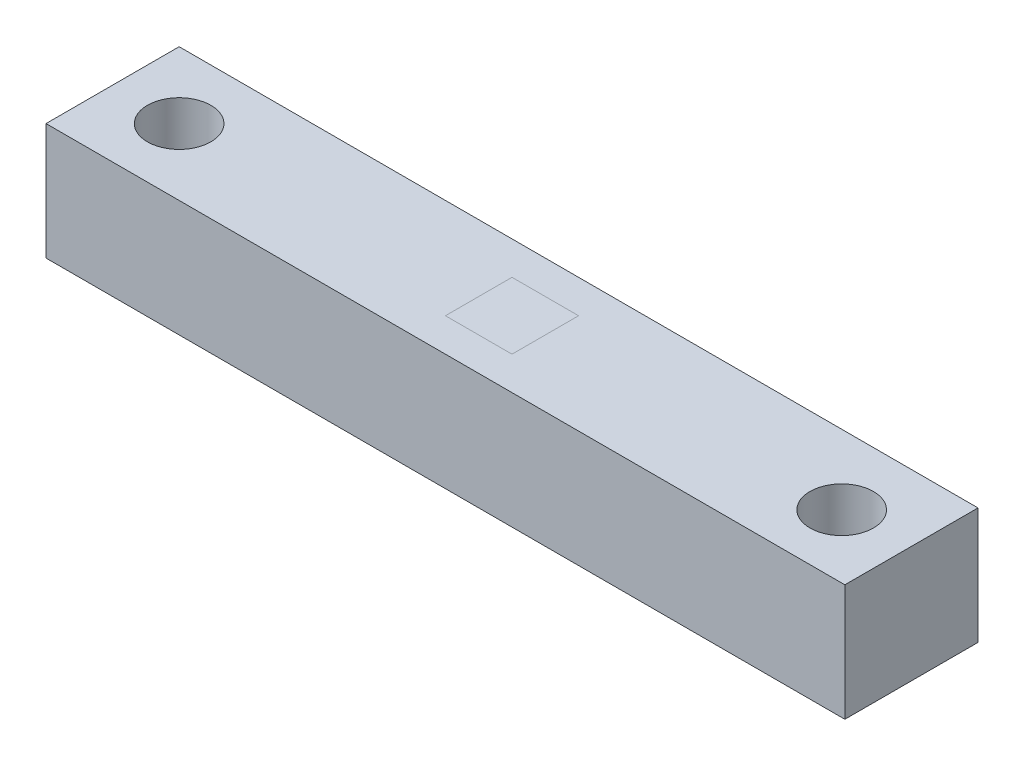
ISO-10303-21;
HEADER;
FILE_DESCRIPTION(('STEP AP214'),'2;1');
FILE_NAME('part.step','',(''),(''),'','','');
FILE_SCHEMA(('AUTOMOTIVE_DESIGN { 1 0 10303 214 1 1 1 1 }'));
ENDSEC;
DATA;
#1=APPLICATION_CONTEXT('core data for automotive mechanical design processes');
#2=APPLICATION_PROTOCOL_DEFINITION('international standard','automotive_design',2000,#1);
#3=PRODUCT_CONTEXT('',#1,'mechanical');
#4=PRODUCT('Part','Part','',(#3));
#5=PRODUCT_RELATED_PRODUCT_CATEGORY('part','',(#4));
#6=PRODUCT_DEFINITION_FORMATION('','',#4);
#7=PRODUCT_DEFINITION_CONTEXT('part definition',#1,'design');
#8=PRODUCT_DEFINITION('design','',#6,#7);
#9=PRODUCT_DEFINITION_SHAPE('','',#8);
#10=(LENGTH_UNIT() NAMED_UNIT(*) SI_UNIT(.MILLI.,.METRE.));
#11=(NAMED_UNIT(*) PLANE_ANGLE_UNIT() SI_UNIT($,.RADIAN.));
#12=(NAMED_UNIT(*) SI_UNIT($,.STERADIAN.) SOLID_ANGLE_UNIT());
#13=UNCERTAINTY_MEASURE_WITH_UNIT(LENGTH_MEASURE(1.E-05),#10,'distance_accuracy_value','');
#14=(GEOMETRIC_REPRESENTATION_CONTEXT(3) GLOBAL_UNCERTAINTY_ASSIGNED_CONTEXT((#13)) GLOBAL_UNIT_ASSIGNED_CONTEXT((#10,
#11,#12)) REPRESENTATION_CONTEXT('',''));
#15=CARTESIAN_POINT('',(0.,0.,0.));
#16=DIRECTION('',(0.,0.,1.));
#17=DIRECTION('',(1.,0.,0.));
#18=AXIS2_PLACEMENT_3D('',#15,#16,#17);
#19=CARTESIAN_POINT('',(120.,17.5,40.));
#20=DIRECTION('',(0.,-1.,0.));
#21=DIRECTION('',(1.,0.,0.));
#22=AXIS2_PLACEMENT_3D('',#19,#20,#21);
#23=PLANE('',#22);
#24=DIRECTION('',(-1.,0.,0.));
#25=VECTOR('',#24,1.);
#26=CARTESIAN_POINT('',(120.,17.5,0.));
#27=LINE('',#26,#25);
#28=CARTESIAN_POINT('',(120.,17.5,0.));
#29=VERTEX_POINT('',#28);
#30=CARTESIAN_POINT('',(-120.,17.5,0.));
#31=VERTEX_POINT('',#30);
#32=EDGE_CURVE('E116',#29,#31,#27,.T.);
#33=ORIENTED_EDGE('',*,*,#32,.T.);
#34=DIRECTION('',(0.,0.,-1.));
#35=VECTOR('',#34,1.);
#36=CARTESIAN_POINT('',(-120.,17.5,40.));
#37=LINE('',#36,#35);
#38=CARTESIAN_POINT('',(-120.,17.5,40.));
#39=VERTEX_POINT('',#38);
#40=EDGE_CURVE('E173',#39,#31,#37,.T.);
#41=ORIENTED_EDGE('',*,*,#40,.F.);
#42=DIRECTION('',(-1.,0.,0.));
#43=VECTOR('',#42,1.);
#44=CARTESIAN_POINT('',(120.,17.5,40.));
#45=LINE('',#44,#43);
#46=CARTESIAN_POINT('',(120.,17.5,40.));
#47=VERTEX_POINT('',#46);
#48=EDGE_CURVE('E115',#47,#39,#45,.T.);
#49=ORIENTED_EDGE('',*,*,#48,.F.);
#50=DIRECTION('',(0.,0.,-1.));
#51=VECTOR('',#50,1.);
#52=CARTESIAN_POINT('',(120.,17.5,40.));
#53=LINE('',#52,#51);
#54=EDGE_CURVE('E123',#47,#29,#53,.T.);
#55=ORIENTED_EDGE('',*,*,#54,.T.);
#56=EDGE_LOOP('',(#33,#41,#49,#55));
#57=FACE_BOUND('',#56,.T.);
#58=CARTESIAN_POINT('',(100.,17.5,20.95));
#59=DIRECTION('',(0.,1.,0.));
#60=DIRECTION('',(-1.,0.,0.));
#61=AXIS2_PLACEMENT_3D('',#58,#59,#60);
#62=CIRCLE('',#61,9.52500000000001);
#63=CARTESIAN_POINT('',(90.475,17.5,20.95));
#64=VERTEX_POINT('',#63);
#65=EDGE_CURVE('E187',#64,#64,#62,.T.);
#66=ORIENTED_EDGE('',*,*,#65,.F.);
#67=EDGE_LOOP('',(#66));
#68=FACE_BOUND('',#67,.T.);
#69=CARTESIAN_POINT('',(-100.,17.5,20.));
#70=DIRECTION('',(0.,1.,0.));
#71=DIRECTION('',(-1.,0.,0.));
#72=AXIS2_PLACEMENT_3D('',#69,#70,#71);
#73=CIRCLE('',#72,9.52500000000001);
#74=CARTESIAN_POINT('',(-109.525,17.5,20.));
#75=VERTEX_POINT('',#74);
#76=EDGE_CURVE('E185',#75,#75,#73,.T.);
#77=ORIENTED_EDGE('',*,*,#76,.F.);
#78=EDGE_LOOP('',(#77));
#79=FACE_BOUND('',#78,.T.);
#80=DIRECTION('',(0.,0.,1.));
#81=VECTOR('',#80,1.);
#82=CARTESIAN_POINT('',(-9.99999999999999,17.5,40.));
#83=LINE('',#82,#81);
#84=CARTESIAN_POINT('',(-9.99999999999999,17.5,10.));
#85=VERTEX_POINT('',#84);
#86=CARTESIAN_POINT('',(-9.99999999999999,17.5,30.));
#87=VERTEX_POINT('',#86);
#88=EDGE_CURVE('E11',#85,#87,#83,.T.);
#89=ORIENTED_EDGE('',*,*,#88,.F.);
#90=DIRECTION('',(-1.,0.,0.));
#91=VECTOR('',#90,1.);
#92=CARTESIAN_POINT('',(120.,17.5,9.99999999999999));
#93=LINE('',#92,#91);
#94=CARTESIAN_POINT('',(10.,17.5,10.));
#95=VERTEX_POINT('',#94);
#96=EDGE_CURVE('E119',#95,#85,#93,.T.);
#97=ORIENTED_EDGE('',*,*,#96,.F.);
#98=DIRECTION('',(0.,0.,-1.));
#99=VECTOR('',#98,1.);
#100=CARTESIAN_POINT('',(10.,17.5,40.));
#101=LINE('',#100,#99);
#102=CARTESIAN_POINT('',(10.,17.5,30.));
#103=VERTEX_POINT('',#102);
#104=EDGE_CURVE('E124',#103,#95,#101,.T.);
#105=ORIENTED_EDGE('',*,*,#104,.F.);
#106=DIRECTION('',(1.,0.,0.));
#107=VECTOR('',#106,1.);
#108=CARTESIAN_POINT('',(120.,17.5,30.));
#109=LINE('',#108,#107);
#110=EDGE_CURVE('E57',#87,#103,#109,.T.);
#111=ORIENTED_EDGE('',*,*,#110,.F.);
#112=EDGE_LOOP('',(#89,#97,#105,#111));
#113=FACE_BOUND('',#112,.T.);
#114=ADVANCED_FACE('F50',(#57,#68,#79,#113),#23,.F.);
#115=CARTESIAN_POINT('',(-120.,-17.5,40.));
#116=DIRECTION('',(1.,0.,0.));
#117=DIRECTION('',(0.,0.,-1.));
#118=AXIS2_PLACEMENT_3D('',#115,#116,#117);
#119=PLANE('',#118);
#120=DIRECTION('',(0.,-1.,0.));
#121=VECTOR('',#120,1.);
#122=CARTESIAN_POINT('',(-120.,-17.5,0.));
#123=LINE('',#122,#121);
#124=CARTESIAN_POINT('',(-120.,-17.5,0.));
#125=VERTEX_POINT('',#124);
#126=EDGE_CURVE('E118',#31,#125,#123,.T.);
#127=ORIENTED_EDGE('',*,*,#126,.T.);
#128=DIRECTION('',(0.,0.,-1.));
#129=VECTOR('',#128,1.);
#130=CARTESIAN_POINT('',(-120.,-17.5,40.));
#131=LINE('',#130,#129);
#132=CARTESIAN_POINT('',(-120.,-17.5,40.));
#133=VERTEX_POINT('',#132);
#134=EDGE_CURVE('E99',#133,#125,#131,.T.);
#135=ORIENTED_EDGE('',*,*,#134,.F.);
#136=DIRECTION('',(0.,-1.,0.));
#137=VECTOR('',#136,1.);
#138=CARTESIAN_POINT('',(-120.,-17.5,40.));
#139=LINE('',#138,#137);
#140=EDGE_CURVE('E110',#39,#133,#139,.T.);
#141=ORIENTED_EDGE('',*,*,#140,.F.);
#142=ORIENTED_EDGE('',*,*,#40,.T.);
#143=EDGE_LOOP('',(#127,#135,#141,#142));
#144=FACE_BOUND('',#143,.T.);
#145=ADVANCED_FACE('F47',(#144),#119,.F.);
#146=CARTESIAN_POINT('',(120.,-17.5,40.));
#147=DIRECTION('',(0.,1.,0.));
#148=DIRECTION('',(-1.,0.,0.));
#149=AXIS2_PLACEMENT_3D('',#146,#147,#148);
#150=PLANE('',#149);
#151=CARTESIAN_POINT('',(-100.,-17.5,20.));
#152=DIRECTION('',(0.,1.,0.));
#153=DIRECTION('',(-1.,0.,0.));
#154=AXIS2_PLACEMENT_3D('',#151,#152,#153);
#155=CIRCLE('',#154,9.52500000000001);
#156=CARTESIAN_POINT('',(-109.525,-17.5,20.));
#157=VERTEX_POINT('',#156);
#158=EDGE_CURVE('E179',#157,#157,#155,.T.);
#159=ORIENTED_EDGE('',*,*,#158,.T.);
#160=EDGE_LOOP('',(#159));
#161=FACE_BOUND('',#160,.T.);
#162=CARTESIAN_POINT('',(100.,-17.5,20.95));
#163=DIRECTION('',(0.,1.,0.));
#164=DIRECTION('',(-1.,0.,0.));
#165=AXIS2_PLACEMENT_3D('',#162,#163,#164);
#166=CIRCLE('',#165,9.52500000000001);
#167=CARTESIAN_POINT('',(90.475,-17.5,20.95));
#168=VERTEX_POINT('',#167);
#169=EDGE_CURVE('E192',#168,#168,#166,.T.);
#170=ORIENTED_EDGE('',*,*,#169,.T.);
#171=EDGE_LOOP('',(#170));
#172=FACE_BOUND('',#171,.T.);
#173=DIRECTION('',(1.,0.,0.));
#174=VECTOR('',#173,1.);
#175=CARTESIAN_POINT('',(120.,-17.5,0.));
#176=LINE('',#175,#174);
#177=CARTESIAN_POINT('',(120.,-17.5,0.));
#178=VERTEX_POINT('',#177);
#179=EDGE_CURVE('E171',#125,#178,#176,.T.);
#180=ORIENTED_EDGE('',*,*,#179,.T.);
#181=DIRECTION('',(0.,0.,-1.));
#182=VECTOR('',#181,1.);
#183=CARTESIAN_POINT('',(120.,-17.5,40.));
#184=LINE('',#183,#182);
#185=CARTESIAN_POINT('',(120.,-17.5,40.));
#186=VERTEX_POINT('',#185);
#187=EDGE_CURVE('E101',#186,#178,#184,.T.);
#188=ORIENTED_EDGE('',*,*,#187,.F.);
#189=DIRECTION('',(1.,0.,0.));
#190=VECTOR('',#189,1.);
#191=CARTESIAN_POINT('',(120.,-17.5,40.));
#192=LINE('',#191,#190);
#193=EDGE_CURVE('E98',#133,#186,#192,.T.);
#194=ORIENTED_EDGE('',*,*,#193,.F.);
#195=ORIENTED_EDGE('',*,*,#134,.T.);
#196=EDGE_LOOP('',(#180,#188,#194,#195));
#197=FACE_BOUND('',#196,.T.);
#198=ADVANCED_FACE('F96',(#161,#172,#197),#150,.F.);
#199=CARTESIAN_POINT('',(120.,-17.5,40.));
#200=DIRECTION('',(-1.,0.,0.));
#201=DIRECTION('',(0.,0.,1.));
#202=AXIS2_PLACEMENT_3D('',#199,#200,#201);
#203=PLANE('',#202);
#204=DIRECTION('',(0.,1.,0.));
#205=VECTOR('',#204,1.);
#206=CARTESIAN_POINT('',(120.,-17.5,0.));
#207=LINE('',#206,#205);
#208=EDGE_CURVE('E170',#178,#29,#207,.T.);
#209=ORIENTED_EDGE('',*,*,#208,.T.);
#210=ORIENTED_EDGE('',*,*,#54,.F.);
#211=DIRECTION('',(0.,1.,0.));
#212=VECTOR('',#211,1.);
#213=CARTESIAN_POINT('',(120.,-17.5,40.));
#214=LINE('',#213,#212);
#215=EDGE_CURVE('E106',#186,#47,#214,.T.);
#216=ORIENTED_EDGE('',*,*,#215,.F.);
#217=ORIENTED_EDGE('',*,*,#187,.T.);
#218=EDGE_LOOP('',(#209,#210,#216,#217));
#219=FACE_BOUND('',#218,.T.);
#220=ADVANCED_FACE('F153',(#219),#203,.F.);
#221=ORIENTED_EDGE('',*,*,#96,.T.);
#222=ORIENTED_EDGE('',*,*,#88,.T.);
#223=ORIENTED_EDGE('',*,*,#110,.T.);
#224=ORIENTED_EDGE('',*,*,#104,.T.);
#225=EDGE_LOOP('',(#221,#222,#223,#224));
#226=FACE_BOUND('',#225,.T.);
#227=ADVANCED_FACE('F138',(#226),#23,.F.);
#228=CARTESIAN_POINT('',(0.,0.,40.));
#229=DIRECTION('',(0.,0.,1.));
#230=DIRECTION('',(1.,0.,0.));
#231=AXIS2_PLACEMENT_3D('',#228,#229,#230);
#232=PLANE('',#231);
#233=ORIENTED_EDGE('',*,*,#140,.T.);
#234=ORIENTED_EDGE('',*,*,#193,.T.);
#235=ORIENTED_EDGE('',*,*,#215,.T.);
#236=ORIENTED_EDGE('',*,*,#48,.T.);
#237=EDGE_LOOP('',(#233,#234,#235,#236));
#238=FACE_BOUND('',#237,.T.);
#239=ADVANCED_FACE('F109',(#238),#232,.T.);
#240=CARTESIAN_POINT('',(0.,0.,0.));
#241=DIRECTION('',(0.,0.,1.));
#242=DIRECTION('',(1.,0.,0.));
#243=AXIS2_PLACEMENT_3D('',#240,#241,#242);
#244=PLANE('',#243);
#245=ORIENTED_EDGE('',*,*,#126,.F.);
#246=ORIENTED_EDGE('',*,*,#32,.F.);
#247=ORIENTED_EDGE('',*,*,#208,.F.);
#248=ORIENTED_EDGE('',*,*,#179,.F.);
#249=EDGE_LOOP('',(#245,#246,#247,#248));
#250=FACE_BOUND('',#249,.T.);
#251=ADVANCED_FACE('F160',(#250),#244,.F.);
#252=CARTESIAN_POINT('',(100.,-17.5,20.95));
#253=DIRECTION('',(0.,1.,0.));
#254=DIRECTION('',(-1.,0.,0.));
#255=AXIS2_PLACEMENT_3D('',#252,#253,#254);
#256=CYLINDRICAL_SURFACE('',#255,9.52500000000001);
#257=ORIENTED_EDGE('',*,*,#169,.F.);
#258=EDGE_LOOP('',(#257));
#259=FACE_BOUND('',#258,.T.);
#260=ORIENTED_EDGE('',*,*,#65,.T.);
#261=EDGE_LOOP('',(#260));
#262=FACE_BOUND('',#261,.T.);
#263=ADVANCED_FACE('F196',(#259,#262),#256,.F.);
#264=CARTESIAN_POINT('',(-100.,-17.5,20.));
#265=DIRECTION('',(0.,1.,0.));
#266=DIRECTION('',(-1.,0.,0.));
#267=AXIS2_PLACEMENT_3D('',#264,#265,#266);
#268=CYLINDRICAL_SURFACE('',#267,9.52500000000001);
#269=ORIENTED_EDGE('',*,*,#158,.F.);
#270=EDGE_LOOP('',(#269));
#271=FACE_BOUND('',#270,.T.);
#272=ORIENTED_EDGE('',*,*,#76,.T.);
#273=EDGE_LOOP('',(#272));
#274=FACE_BOUND('',#273,.T.);
#275=ADVANCED_FACE('F197',(#271,#274),#268,.F.);
#276=CLOSED_SHELL('',(#114,#145,#198,#220,#227,#239,#251,#263,#275));
#277=MANIFOLD_SOLID_BREP('B2',#276);
#278=ADVANCED_BREP_SHAPE_REPRESENTATION('',(#18,#277),#14);
#279=SHAPE_DEFINITION_REPRESENTATION(#9,#278);
ENDSEC;
END-ISO-10303-21;
